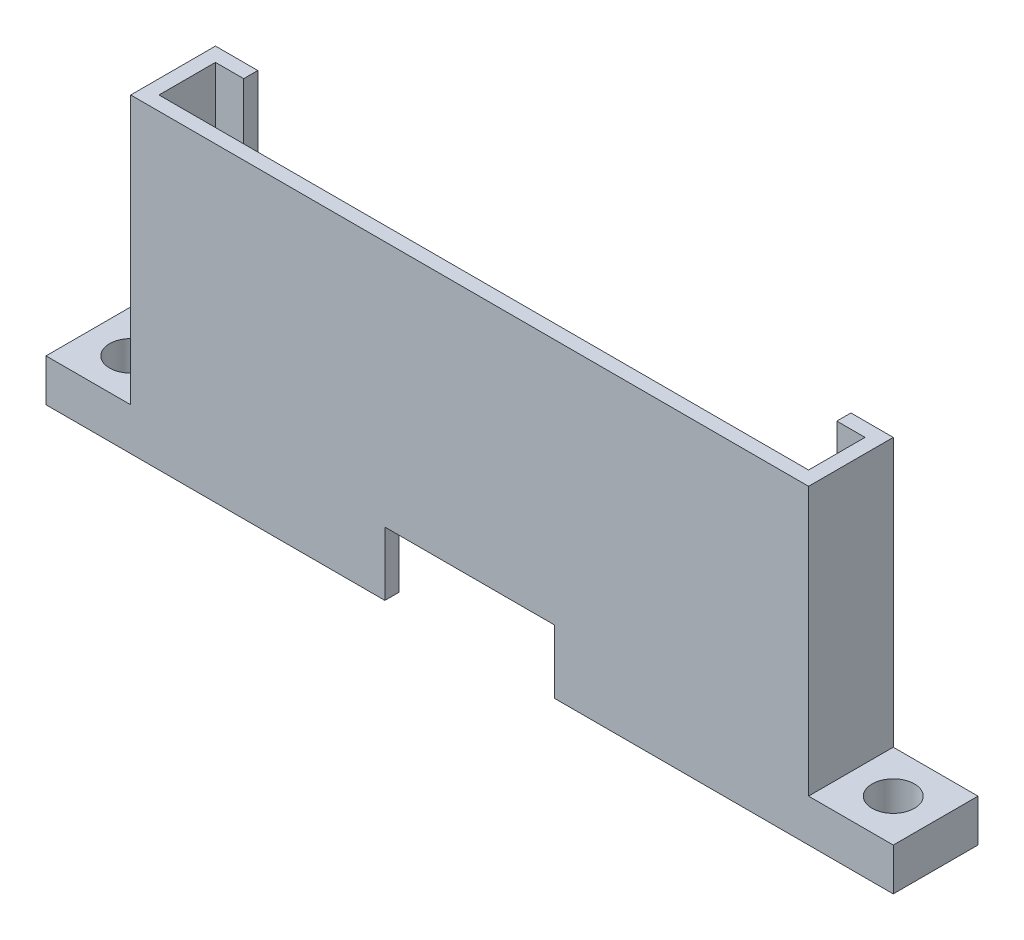
ISO-10303-21;
HEADER;
FILE_DESCRIPTION(('STEP AP214'),'2;1');
FILE_NAME('part.step','',(''),(''),'','','');
FILE_SCHEMA(('AUTOMOTIVE_DESIGN { 1 0 10303 214 1 1 1 1 }'));
ENDSEC;
DATA;
#1=APPLICATION_CONTEXT('core data for automotive mechanical design processes');
#2=APPLICATION_PROTOCOL_DEFINITION('international standard','automotive_design',2000,#1);
#3=PRODUCT_CONTEXT('',#1,'mechanical');
#4=PRODUCT('Part','Part','',(#3));
#5=PRODUCT_RELATED_PRODUCT_CATEGORY('part','',(#4));
#6=PRODUCT_DEFINITION_FORMATION('','',#4);
#7=PRODUCT_DEFINITION_CONTEXT('part definition',#1,'design');
#8=PRODUCT_DEFINITION('design','',#6,#7);
#9=PRODUCT_DEFINITION_SHAPE('','',#8);
#10=(LENGTH_UNIT() NAMED_UNIT(*) SI_UNIT(.MILLI.,.METRE.));
#11=(NAMED_UNIT(*) PLANE_ANGLE_UNIT() SI_UNIT($,.RADIAN.));
#12=(NAMED_UNIT(*) SI_UNIT($,.STERADIAN.) SOLID_ANGLE_UNIT());
#13=UNCERTAINTY_MEASURE_WITH_UNIT(LENGTH_MEASURE(1.E-05),#10,'distance_accuracy_value','');
#14=(GEOMETRIC_REPRESENTATION_CONTEXT(3) GLOBAL_UNCERTAINTY_ASSIGNED_CONTEXT((#13)) GLOBAL_UNIT_ASSIGNED_CONTEXT((#10,
#11,#12)) REPRESENTATION_CONTEXT('',''));
#15=CARTESIAN_POINT('',(0.,0.,0.));
#16=DIRECTION('',(0.,0.,1.));
#17=DIRECTION('',(1.,0.,0.));
#18=AXIS2_PLACEMENT_3D('',#15,#16,#17);
#19=CARTESIAN_POINT('',(0.,-22.,6.));
#20=DIRECTION('',(0.,1.,0.));
#21=DIRECTION('',(-1.,0.,0.));
#22=AXIS2_PLACEMENT_3D('',#19,#20,#21);
#23=PLANE('',#22);
#24=CARTESIAN_POINT('',(3.,-22.,3.));
#25=DIRECTION('',(0.,1.,0.));
#26=DIRECTION('',(-1.,0.,0.));
#27=AXIS2_PLACEMENT_3D('',#24,#25,#26);
#28=CIRCLE('',#27,1.5);
#29=CARTESIAN_POINT('',(1.5,-22.,3.));
#30=VERTEX_POINT('',#29);
#31=EDGE_CURVE('E195',#30,#30,#28,.T.);
#32=ORIENTED_EDGE('',*,*,#31,.T.);
#33=EDGE_LOOP('',(#32));
#34=FACE_BOUND('',#33,.T.);
#35=DIRECTION('',(0.,0.,1.));
#36=VECTOR('',#35,1.);
#37=CARTESIAN_POINT('',(-18.,-22.,0.));
#38=LINE('',#37,#36);
#39=CARTESIAN_POINT('',(-18.,-22.,5.));
#40=VERTEX_POINT('',#39);
#41=CARTESIAN_POINT('',(-18.,-22.,6.));
#42=VERTEX_POINT('',#41);
#43=EDGE_CURVE('E227',#40,#42,#38,.T.);
#44=ORIENTED_EDGE('',*,*,#43,.F.);
#45=DIRECTION('',(1.,0.,0.));
#46=VECTOR('',#45,1.);
#47=CARTESIAN_POINT('',(-47.,-22.,5.));
#48=LINE('',#47,#46);
#49=CARTESIAN_POINT('',(-0.999999999999998,-22.,5.));
#50=VERTEX_POINT('',#49);
#51=EDGE_CURVE('E268',#40,#50,#48,.T.);
#52=ORIENTED_EDGE('',*,*,#51,.T.);
#53=DIRECTION('',(0.,0.,-1.));
#54=VECTOR('',#53,1.);
#55=CARTESIAN_POINT('',(-0.999999999999998,-22.,5.));
#56=LINE('',#55,#54);
#57=CARTESIAN_POINT('',(-0.999999999999995,-22.,1.));
#58=VERTEX_POINT('',#57);
#59=EDGE_CURVE('E257',#50,#58,#56,.T.);
#60=ORIENTED_EDGE('',*,*,#59,.T.);
#61=DIRECTION('',(-1.,0.,0.));
#62=VECTOR('',#61,1.);
#63=CARTESIAN_POINT('',(-47.,-22.,1.));
#64=LINE('',#63,#62);
#65=CARTESIAN_POINT('',(-3.,-22.,1.));
#66=VERTEX_POINT('',#65);
#67=EDGE_CURVE('E262',#58,#66,#64,.T.);
#68=ORIENTED_EDGE('',*,*,#67,.T.);
#69=DIRECTION('',(0.,0.,1.));
#70=VECTOR('',#69,1.);
#71=CARTESIAN_POINT('',(-3.,-22.,0.));
#72=LINE('',#71,#70);
#73=CARTESIAN_POINT('',(-3.,-22.,0.));
#74=VERTEX_POINT('',#73);
#75=EDGE_CURVE('E237',#74,#66,#72,.T.);
#76=ORIENTED_EDGE('',*,*,#75,.F.);
#77=DIRECTION('',(1.,0.,0.));
#78=VECTOR('',#77,1.);
#79=CARTESIAN_POINT('',(0.,-22.,0.));
#80=LINE('',#79,#78);
#81=CARTESIAN_POINT('',(6.,-22.,0.));
#82=VERTEX_POINT('',#81);
#83=EDGE_CURVE('E311',#74,#82,#80,.T.);
#84=ORIENTED_EDGE('',*,*,#83,.T.);
#85=DIRECTION('',(0.,0.,-1.));
#86=VECTOR('',#85,1.);
#87=CARTESIAN_POINT('',(6.,-22.,6.));
#88=LINE('',#87,#86);
#89=CARTESIAN_POINT('',(6.,-22.,6.));
#90=VERTEX_POINT('',#89);
#91=EDGE_CURVE('E209',#90,#82,#88,.T.);
#92=ORIENTED_EDGE('',*,*,#91,.F.);
#93=DIRECTION('',(1.,0.,0.));
#94=VECTOR('',#93,1.);
#95=CARTESIAN_POINT('',(0.,-22.,6.));
#96=LINE('',#95,#94);
#97=EDGE_CURVE('E299',#42,#90,#96,.T.);
#98=ORIENTED_EDGE('',*,*,#97,.F.);
#99=EDGE_LOOP('',(#44,#52,#60,#68,#76,#84,#92,#98));
#100=FACE_BOUND('',#99,.T.);
#101=ADVANCED_FACE('F33',(#34,#100),#23,.F.);
#102=CARTESIAN_POINT('',(0.,0.,0.));
#103=DIRECTION('',(0.,0.,-1.));
#104=DIRECTION('',(-1.,0.,0.));
#105=AXIS2_PLACEMENT_3D('',#102,#103,#104);
#106=PLANE('',#105);
#107=ORIENTED_EDGE('',*,*,#83,.F.);
#108=DIRECTION('',(0.,1.,0.));
#109=VECTOR('',#108,1.);
#110=CARTESIAN_POINT('',(-3.,-22.,0.));
#111=LINE('',#110,#109);
#112=CARTESIAN_POINT('',(-3.,0.,0.));
#113=VERTEX_POINT('',#112);
#114=EDGE_CURVE('E253',#74,#113,#111,.T.);
#115=ORIENTED_EDGE('',*,*,#114,.T.);
#116=DIRECTION('',(-1.,0.,0.));
#117=VECTOR('',#116,1.);
#118=CARTESIAN_POINT('',(0.,0.,0.));
#119=LINE('',#118,#117);
#120=CARTESIAN_POINT('',(0.,0.,0.));
#121=VERTEX_POINT('',#120);
#122=EDGE_CURVE('E305',#121,#113,#119,.T.);
#123=ORIENTED_EDGE('',*,*,#122,.F.);
#124=DIRECTION('',(0.,1.,0.));
#125=VECTOR('',#124,1.);
#126=CARTESIAN_POINT('',(0.,0.,0.));
#127=LINE('',#126,#125);
#128=CARTESIAN_POINT('',(0.,-19.,0.));
#129=VERTEX_POINT('',#128);
#130=EDGE_CURVE('E285',#129,#121,#127,.T.);
#131=ORIENTED_EDGE('',*,*,#130,.F.);
#132=DIRECTION('',(-1.,0.,0.));
#133=VECTOR('',#132,1.);
#134=CARTESIAN_POINT('',(6.,-19.,0.));
#135=LINE('',#134,#133);
#136=CARTESIAN_POINT('',(6.,-19.,0.));
#137=VERTEX_POINT('',#136);
#138=EDGE_CURVE('E56',#137,#129,#135,.T.);
#139=ORIENTED_EDGE('',*,*,#138,.F.);
#140=DIRECTION('',(0.,1.,0.));
#141=VECTOR('',#140,1.);
#142=CARTESIAN_POINT('',(6.,-22.,0.));
#143=LINE('',#142,#141);
#144=EDGE_CURVE('E207',#82,#137,#143,.T.);
#145=ORIENTED_EDGE('',*,*,#144,.F.);
#146=EDGE_LOOP('',(#107,#115,#123,#131,#139,#145));
#147=FACE_BOUND('',#146,.T.);
#148=ADVANCED_FACE('F368',(#147),#106,.T.);
#149=CARTESIAN_POINT('',(-47.,-22.,1.));
#150=DIRECTION('',(0.,0.,-1.));
#151=DIRECTION('',(-1.,0.,0.));
#152=AXIS2_PLACEMENT_3D('',#149,#150,#151);
#153=PLANE('',#152);
#154=DIRECTION('',(0.,1.,0.));
#155=VECTOR('',#154,1.);
#156=CARTESIAN_POINT('',(-3.,-22.,1.));
#157=LINE('',#156,#155);
#158=CARTESIAN_POINT('',(-3.,0.,1.));
#159=VERTEX_POINT('',#158);
#160=EDGE_CURVE('E243',#66,#159,#157,.T.);
#161=ORIENTED_EDGE('',*,*,#160,.F.);
#162=ORIENTED_EDGE('',*,*,#67,.F.);
#163=DIRECTION('',(0.,1.,0.));
#164=VECTOR('',#163,1.);
#165=CARTESIAN_POINT('',(-0.999999999999995,-22.,1.));
#166=LINE('',#165,#164);
#167=CARTESIAN_POINT('',(-0.999999999999995,0.,1.));
#168=VERTEX_POINT('',#167);
#169=EDGE_CURVE('E272',#58,#168,#166,.T.);
#170=ORIENTED_EDGE('',*,*,#169,.T.);
#171=DIRECTION('',(-1.,0.,0.));
#172=VECTOR('',#171,1.);
#173=CARTESIAN_POINT('',(-47.,0.,1.));
#174=LINE('',#173,#172);
#175=EDGE_CURVE('E275',#168,#159,#174,.T.);
#176=ORIENTED_EDGE('',*,*,#175,.T.);
#177=EDGE_LOOP('',(#161,#162,#170,#176));
#178=FACE_BOUND('',#177,.T.);
#179=ADVANCED_FACE('F362',(#178),#153,.F.);
#180=CARTESIAN_POINT('',(0.,0.,6.));
#181=DIRECTION('',(-1.,0.,0.));
#182=DIRECTION('',(0.,-1.,0.));
#183=AXIS2_PLACEMENT_3D('',#180,#181,#182);
#184=PLANE('',#183);
#185=DIRECTION('',(0.,1.,0.));
#186=VECTOR('',#185,1.);
#187=CARTESIAN_POINT('',(0.,0.,6.));
#188=LINE('',#187,#186);
#189=CARTESIAN_POINT('',(0.,-19.,6.));
#190=VERTEX_POINT('',#189);
#191=CARTESIAN_POINT('',(0.,0.,6.));
#192=VERTEX_POINT('',#191);
#193=EDGE_CURVE('E293',#190,#192,#188,.T.);
#194=ORIENTED_EDGE('',*,*,#193,.F.);
#195=DIRECTION('',(0.,0.,-1.));
#196=VECTOR('',#195,1.);
#197=CARTESIAN_POINT('',(0.,-19.,6.));
#198=LINE('',#197,#196);
#199=EDGE_CURVE('E203',#190,#129,#198,.T.);
#200=ORIENTED_EDGE('',*,*,#199,.T.);
#201=ORIENTED_EDGE('',*,*,#130,.T.);
#202=DIRECTION('',(0.,0.,-1.));
#203=VECTOR('',#202,1.);
#204=CARTESIAN_POINT('',(0.,0.,6.));
#205=LINE('',#204,#203);
#206=EDGE_CURVE('E316',#192,#121,#205,.T.);
#207=ORIENTED_EDGE('',*,*,#206,.F.);
#208=EDGE_LOOP('',(#194,#200,#201,#207));
#209=FACE_BOUND('',#208,.T.);
#210=ADVANCED_FACE('F35',(#209),#184,.F.);
#211=CARTESIAN_POINT('',(0.,0.,6.));
#212=DIRECTION('',(0.,-1.,0.));
#213=DIRECTION('',(1.,0.,0.));
#214=AXIS2_PLACEMENT_3D('',#211,#212,#213);
#215=PLANE('',#214);
#216=CARTESIAN_POINT('',(-45.,0.,1.));
#217=VERTEX_POINT('',#216);
#218=CARTESIAN_POINT('',(-47.,0.,1.));
#219=VERTEX_POINT('',#218);
#220=EDGE_CURVE('E274',#217,#219,#174,.T.);
#221=ORIENTED_EDGE('',*,*,#220,.F.);
#222=DIRECTION('',(0.,0.,1.));
#223=VECTOR('',#222,1.);
#224=CARTESIAN_POINT('',(-45.,0.,0.));
#225=LINE('',#224,#223);
#226=CARTESIAN_POINT('',(-45.,0.,0.));
#227=VERTEX_POINT('',#226);
#228=EDGE_CURVE('E240',#227,#217,#225,.T.);
#229=ORIENTED_EDGE('',*,*,#228,.F.);
#230=CARTESIAN_POINT('',(-48.,0.,0.));
#231=VERTEX_POINT('',#230);
#232=EDGE_CURVE('E304',#227,#231,#119,.T.);
#233=ORIENTED_EDGE('',*,*,#232,.T.);
#234=DIRECTION('',(0.,0.,-1.));
#235=VECTOR('',#234,1.);
#236=CARTESIAN_POINT('',(-48.,0.,6.));
#237=LINE('',#236,#235);
#238=CARTESIAN_POINT('',(-48.,0.,6.));
#239=VERTEX_POINT('',#238);
#240=EDGE_CURVE('E302',#239,#231,#237,.T.);
#241=ORIENTED_EDGE('',*,*,#240,.F.);
#242=DIRECTION('',(-1.,0.,0.));
#243=VECTOR('',#242,1.);
#244=CARTESIAN_POINT('',(0.,0.,6.));
#245=LINE('',#244,#243);
#246=EDGE_CURVE('E295',#192,#239,#245,.T.);
#247=ORIENTED_EDGE('',*,*,#246,.F.);
#248=ORIENTED_EDGE('',*,*,#206,.T.);
#249=ORIENTED_EDGE('',*,*,#122,.T.);
#250=DIRECTION('',(0.,0.,1.));
#251=VECTOR('',#250,1.);
#252=CARTESIAN_POINT('',(-3.,0.,0.));
#253=LINE('',#252,#251);
#254=EDGE_CURVE('E231',#113,#159,#253,.T.);
#255=ORIENTED_EDGE('',*,*,#254,.T.);
#256=ORIENTED_EDGE('',*,*,#175,.F.);
#257=DIRECTION('',(0.,0.,-1.));
#258=VECTOR('',#257,1.);
#259=CARTESIAN_POINT('',(-1.,0.,5.));
#260=LINE('',#259,#258);
#261=CARTESIAN_POINT('',(-1.,0.,5.));
#262=VERTEX_POINT('',#261);
#263=EDGE_CURVE('E250',#262,#168,#260,.T.);
#264=ORIENTED_EDGE('',*,*,#263,.F.);
#265=DIRECTION('',(1.,0.,0.));
#266=VECTOR('',#265,1.);
#267=CARTESIAN_POINT('',(-47.,0.,5.));
#268=LINE('',#267,#266);
#269=CARTESIAN_POINT('',(-47.,0.,5.));
#270=VERTEX_POINT('',#269);
#271=EDGE_CURVE('E261',#270,#262,#268,.T.);
#272=ORIENTED_EDGE('',*,*,#271,.F.);
#273=DIRECTION('',(0.,0.,1.));
#274=VECTOR('',#273,1.);
#275=CARTESIAN_POINT('',(-47.,0.,5.));
#276=LINE('',#275,#274);
#277=EDGE_CURVE('E278',#219,#270,#276,.T.);
#278=ORIENTED_EDGE('',*,*,#277,.F.);
#279=EDGE_LOOP('',(#221,#229,#233,#241,#247,#248,#249,#255,#256,#264,#272,#278));
#280=FACE_BOUND('',#279,.T.);
#281=ADVANCED_FACE('F354',(#280),#215,.F.);
#282=CARTESIAN_POINT('',(-48.,0.,6.));
#283=DIRECTION('',(1.,0.,0.));
#284=DIRECTION('',(0.,0.,-1.));
#285=AXIS2_PLACEMENT_3D('',#282,#283,#284);
#286=PLANE('',#285);
#287=DIRECTION('',(0.,-1.,0.));
#288=VECTOR('',#287,1.);
#289=CARTESIAN_POINT('',(-48.,0.,0.));
#290=LINE('',#289,#288);
#291=CARTESIAN_POINT('',(-48.,-19.,0.));
#292=VERTEX_POINT('',#291);
#293=EDGE_CURVE('E308',#231,#292,#290,.T.);
#294=ORIENTED_EDGE('',*,*,#293,.T.);
#295=DIRECTION('',(0.,0.,1.));
#296=VECTOR('',#295,1.);
#297=CARTESIAN_POINT('',(-48.,-19.,0.));
#298=LINE('',#297,#296);
#299=CARTESIAN_POINT('',(-48.,-19.,6.));
#300=VERTEX_POINT('',#299);
#301=EDGE_CURVE('E193',#292,#300,#298,.T.);
#302=ORIENTED_EDGE('',*,*,#301,.T.);
#303=DIRECTION('',(0.,-1.,0.));
#304=VECTOR('',#303,1.);
#305=CARTESIAN_POINT('',(-48.,0.,6.));
#306=LINE('',#305,#304);
#307=EDGE_CURVE('E188',#239,#300,#306,.T.);
#308=ORIENTED_EDGE('',*,*,#307,.F.);
#309=ORIENTED_EDGE('',*,*,#240,.T.);
#310=EDGE_LOOP('',(#294,#302,#308,#309));
#311=FACE_BOUND('',#310,.T.);
#312=ADVANCED_FACE('F405',(#311),#286,.F.);
#313=CARTESIAN_POINT('',(-51.,-22.,3.));
#314=DIRECTION('',(0.,1.,0.));
#315=DIRECTION('',(0.,0.,1.));
#316=AXIS2_PLACEMENT_3D('',#313,#314,#315);
#317=CIRCLE('',#316,1.5);
#318=CARTESIAN_POINT('',(-51.,-22.,4.5));
#319=VERTEX_POINT('',#318);
#320=EDGE_CURVE('E415',#319,#319,#317,.T.);
#321=ORIENTED_EDGE('',*,*,#320,.T.);
#322=EDGE_LOOP('',(#321));
#323=FACE_BOUND('',#322,.T.);
#324=CARTESIAN_POINT('',(-47.,-22.,5.));
#325=VERTEX_POINT('',#324);
#326=CARTESIAN_POINT('',(-30.,-22.,5.));
#327=VERTEX_POINT('',#326);
#328=EDGE_CURVE('E269',#325,#327,#48,.T.);
#329=ORIENTED_EDGE('',*,*,#328,.T.);
#330=DIRECTION('',(0.,0.,1.));
#331=VECTOR('',#330,1.);
#332=CARTESIAN_POINT('',(-30.,-22.,0.));
#333=LINE('',#332,#331);
#334=CARTESIAN_POINT('',(-30.,-22.,6.));
#335=VERTEX_POINT('',#334);
#336=EDGE_CURVE('E228',#327,#335,#333,.T.);
#337=ORIENTED_EDGE('',*,*,#336,.T.);
#338=CARTESIAN_POINT('',(-54.,-22.,6.));
#339=VERTEX_POINT('',#338);
#340=EDGE_CURVE('E300',#339,#335,#96,.T.);
#341=ORIENTED_EDGE('',*,*,#340,.F.);
#342=DIRECTION('',(0.,0.,1.));
#343=VECTOR('',#342,1.);
#344=CARTESIAN_POINT('',(-54.,-22.,0.));
#345=LINE('',#344,#343);
#346=CARTESIAN_POINT('',(-54.,-22.,0.));
#347=VERTEX_POINT('',#346);
#348=EDGE_CURVE('E181',#347,#339,#345,.T.);
#349=ORIENTED_EDGE('',*,*,#348,.F.);
#350=CARTESIAN_POINT('',(-45.,-22.,0.));
#351=VERTEX_POINT('',#350);
#352=EDGE_CURVE('E296',#347,#351,#80,.T.);
#353=ORIENTED_EDGE('',*,*,#352,.T.);
#354=DIRECTION('',(0.,0.,1.));
#355=VECTOR('',#354,1.);
#356=CARTESIAN_POINT('',(-45.,-22.,0.));
#357=LINE('',#356,#355);
#358=CARTESIAN_POINT('',(-45.,-22.,1.));
#359=VERTEX_POINT('',#358);
#360=EDGE_CURVE('E239',#351,#359,#357,.T.);
#361=ORIENTED_EDGE('',*,*,#360,.T.);
#362=CARTESIAN_POINT('',(-47.,-22.,1.));
#363=VERTEX_POINT('',#362);
#364=EDGE_CURVE('E260',#359,#363,#64,.T.);
#365=ORIENTED_EDGE('',*,*,#364,.T.);
#366=DIRECTION('',(0.,0.,1.));
#367=VECTOR('',#366,1.);
#368=CARTESIAN_POINT('',(-47.,-22.,5.));
#369=LINE('',#368,#367);
#370=EDGE_CURVE('E265',#363,#325,#369,.T.);
#371=ORIENTED_EDGE('',*,*,#370,.T.);
#372=EDGE_LOOP('',(#329,#337,#341,#349,#353,#361,#365,#371));
#373=FACE_BOUND('',#372,.T.);
#374=ADVANCED_FACE('F343',(#323,#373),#23,.F.);
#375=CARTESIAN_POINT('',(0.,0.,6.));
#376=DIRECTION('',(0.,0.,-1.));
#377=DIRECTION('',(-1.,0.,0.));
#378=AXIS2_PLACEMENT_3D('',#375,#376,#377);
#379=PLANE('',#378);
#380=ORIENTED_EDGE('',*,*,#340,.T.);
#381=DIRECTION('',(0.,-1.,0.));
#382=VECTOR('',#381,1.);
#383=CARTESIAN_POINT('',(-30.,-17.5,6.));
#384=LINE('',#383,#382);
#385=CARTESIAN_POINT('',(-30.,-17.5,6.));
#386=VERTEX_POINT('',#385);
#387=EDGE_CURVE('E225',#386,#335,#384,.T.);
#388=ORIENTED_EDGE('',*,*,#387,.F.);
#389=DIRECTION('',(1.,0.,0.));
#390=VECTOR('',#389,1.);
#391=CARTESIAN_POINT('',(-30.,-17.5,6.));
#392=LINE('',#391,#390);
#393=CARTESIAN_POINT('',(-18.,-17.5,6.));
#394=VERTEX_POINT('',#393);
#395=EDGE_CURVE('E222',#386,#394,#392,.T.);
#396=ORIENTED_EDGE('',*,*,#395,.T.);
#397=DIRECTION('',(0.,-1.,0.));
#398=VECTOR('',#397,1.);
#399=CARTESIAN_POINT('',(-18.,-17.5,6.));
#400=LINE('',#399,#398);
#401=EDGE_CURVE('E218',#394,#42,#400,.T.);
#402=ORIENTED_EDGE('',*,*,#401,.T.);
#403=ORIENTED_EDGE('',*,*,#97,.T.);
#404=DIRECTION('',(0.,1.,0.));
#405=VECTOR('',#404,1.);
#406=CARTESIAN_POINT('',(6.,-22.,6.));
#407=LINE('',#406,#405);
#408=CARTESIAN_POINT('',(6.,-19.,6.));
#409=VERTEX_POINT('',#408);
#410=EDGE_CURVE('E212',#90,#409,#407,.T.);
#411=ORIENTED_EDGE('',*,*,#410,.T.);
#412=DIRECTION('',(-1.,0.,0.));
#413=VECTOR('',#412,1.);
#414=CARTESIAN_POINT('',(6.,-19.,6.));
#415=LINE('',#414,#413);
#416=EDGE_CURVE('E216',#409,#190,#415,.T.);
#417=ORIENTED_EDGE('',*,*,#416,.T.);
#418=ORIENTED_EDGE('',*,*,#193,.T.);
#419=ORIENTED_EDGE('',*,*,#246,.T.);
#420=ORIENTED_EDGE('',*,*,#307,.T.);
#421=DIRECTION('',(1.,0.,0.));
#422=VECTOR('',#421,1.);
#423=CARTESIAN_POINT('',(-54.,-19.,6.));
#424=LINE('',#423,#422);
#425=CARTESIAN_POINT('',(-54.,-19.,6.));
#426=VERTEX_POINT('',#425);
#427=EDGE_CURVE('E48',#426,#300,#424,.T.);
#428=ORIENTED_EDGE('',*,*,#427,.F.);
#429=DIRECTION('',(0.,1.,0.));
#430=VECTOR('',#429,1.);
#431=CARTESIAN_POINT('',(-54.,-22.,6.));
#432=LINE('',#431,#430);
#433=EDGE_CURVE('E175',#339,#426,#432,.T.);
#434=ORIENTED_EDGE('',*,*,#433,.F.);
#435=EDGE_LOOP('',(#380,#388,#396,#402,#403,#411,#417,#418,#419,#420,#428,#434));
#436=FACE_BOUND('',#435,.T.);
#437=ADVANCED_FACE('F186',(#436),#379,.F.);
#438=DIRECTION('',(0.,1.,0.));
#439=VECTOR('',#438,1.);
#440=CARTESIAN_POINT('',(-45.,-22.,0.));
#441=LINE('',#440,#439);
#442=EDGE_CURVE('E251',#351,#227,#441,.T.);
#443=ORIENTED_EDGE('',*,*,#442,.F.);
#444=ORIENTED_EDGE('',*,*,#352,.F.);
#445=DIRECTION('',(0.,1.,0.));
#446=VECTOR('',#445,1.);
#447=CARTESIAN_POINT('',(-54.,-22.,0.));
#448=LINE('',#447,#446);
#449=CARTESIAN_POINT('',(-54.,-19.,0.));
#450=VERTEX_POINT('',#449);
#451=EDGE_CURVE('E190',#347,#450,#448,.T.);
#452=ORIENTED_EDGE('',*,*,#451,.T.);
#453=DIRECTION('',(1.,0.,0.));
#454=VECTOR('',#453,1.);
#455=CARTESIAN_POINT('',(-54.,-19.,0.));
#456=LINE('',#455,#454);
#457=EDGE_CURVE('E189',#450,#292,#456,.T.);
#458=ORIENTED_EDGE('',*,*,#457,.T.);
#459=ORIENTED_EDGE('',*,*,#293,.F.);
#460=ORIENTED_EDGE('',*,*,#232,.F.);
#461=EDGE_LOOP('',(#443,#444,#452,#458,#459,#460));
#462=FACE_BOUND('',#461,.T.);
#463=ADVANCED_FACE('F401',(#462),#106,.T.);
#464=CARTESIAN_POINT('',(-0.999999999999998,-22.,5.));
#465=DIRECTION('',(1.,0.,0.));
#466=DIRECTION('',(0.,0.,-1.));
#467=AXIS2_PLACEMENT_3D('',#464,#465,#466);
#468=PLANE('',#467);
#469=ORIENTED_EDGE('',*,*,#263,.T.);
#470=ORIENTED_EDGE('',*,*,#169,.F.);
#471=ORIENTED_EDGE('',*,*,#59,.F.);
#472=DIRECTION('',(0.,1.,0.));
#473=VECTOR('',#472,1.);
#474=CARTESIAN_POINT('',(-0.999999999999998,-22.,5.));
#475=LINE('',#474,#473);
#476=EDGE_CURVE('E283',#50,#262,#475,.T.);
#477=ORIENTED_EDGE('',*,*,#476,.T.);
#478=EDGE_LOOP('',(#469,#470,#471,#477));
#479=FACE_BOUND('',#478,.T.);
#480=ADVANCED_FACE('F357',(#479),#468,.F.);
#481=CARTESIAN_POINT('',(-47.,-22.,5.));
#482=DIRECTION('',(0.,0.,1.));
#483=DIRECTION('',(1.,0.,0.));
#484=AXIS2_PLACEMENT_3D('',#481,#482,#483);
#485=PLANE('',#484);
#486=DIRECTION('',(1.,0.,0.));
#487=VECTOR('',#486,1.);
#488=CARTESIAN_POINT('',(-47.,-17.5,5.));
#489=LINE('',#488,#487);
#490=CARTESIAN_POINT('',(-30.,-17.5,5.));
#491=VERTEX_POINT('',#490);
#492=CARTESIAN_POINT('',(-18.,-17.5,5.));
#493=VERTEX_POINT('',#492);
#494=EDGE_CURVE('E41',#491,#493,#489,.T.);
#495=ORIENTED_EDGE('',*,*,#494,.F.);
#496=DIRECTION('',(0.,-1.,0.));
#497=VECTOR('',#496,1.);
#498=CARTESIAN_POINT('',(-30.,-22.,5.));
#499=LINE('',#498,#497);
#500=EDGE_CURVE('E11',#491,#327,#499,.T.);
#501=ORIENTED_EDGE('',*,*,#500,.T.);
#502=ORIENTED_EDGE('',*,*,#328,.F.);
#503=DIRECTION('',(0.,1.,0.));
#504=VECTOR('',#503,1.);
#505=CARTESIAN_POINT('',(-47.,-22.,5.));
#506=LINE('',#505,#504);
#507=EDGE_CURVE('E286',#325,#270,#506,.T.);
#508=ORIENTED_EDGE('',*,*,#507,.T.);
#509=ORIENTED_EDGE('',*,*,#271,.T.);
#510=ORIENTED_EDGE('',*,*,#476,.F.);
#511=ORIENTED_EDGE('',*,*,#51,.F.);
#512=DIRECTION('',(0.,-1.,0.));
#513=VECTOR('',#512,1.);
#514=CARTESIAN_POINT('',(-18.,-22.,5.));
#515=LINE('',#514,#513);
#516=EDGE_CURVE('E319',#493,#40,#515,.T.);
#517=ORIENTED_EDGE('',*,*,#516,.F.);
#518=EDGE_LOOP('',(#495,#501,#502,#508,#509,#510,#511,#517));
#519=FACE_BOUND('',#518,.T.);
#520=ADVANCED_FACE('F330',(#519),#485,.F.);
#521=CARTESIAN_POINT('',(-47.,-22.,5.));
#522=DIRECTION('',(-1.,0.,0.));
#523=DIRECTION('',(0.,-1.,0.));
#524=AXIS2_PLACEMENT_3D('',#521,#522,#523);
#525=PLANE('',#524);
#526=ORIENTED_EDGE('',*,*,#277,.T.);
#527=ORIENTED_EDGE('',*,*,#507,.F.);
#528=ORIENTED_EDGE('',*,*,#370,.F.);
#529=DIRECTION('',(0.,1.,0.));
#530=VECTOR('',#529,1.);
#531=CARTESIAN_POINT('',(-47.,-22.,1.));
#532=LINE('',#531,#530);
#533=EDGE_CURVE('E288',#363,#219,#532,.T.);
#534=ORIENTED_EDGE('',*,*,#533,.T.);
#535=EDGE_LOOP('',(#526,#527,#528,#534));
#536=FACE_BOUND('',#535,.T.);
#537=ADVANCED_FACE('F350',(#536),#525,.F.);
#538=ORIENTED_EDGE('',*,*,#364,.F.);
#539=DIRECTION('',(0.,1.,0.));
#540=VECTOR('',#539,1.);
#541=CARTESIAN_POINT('',(-45.,-22.,1.));
#542=LINE('',#541,#540);
#543=EDGE_CURVE('E247',#359,#217,#542,.T.);
#544=ORIENTED_EDGE('',*,*,#543,.T.);
#545=ORIENTED_EDGE('',*,*,#220,.T.);
#546=ORIENTED_EDGE('',*,*,#533,.F.);
#547=EDGE_LOOP('',(#538,#544,#545,#546));
#548=FACE_BOUND('',#547,.T.);
#549=ADVANCED_FACE('F383',(#548),#153,.F.);
#550=CARTESIAN_POINT('',(-3.,-22.,0.));
#551=DIRECTION('',(-1.,0.,0.));
#552=DIRECTION('',(0.,-1.,0.));
#553=AXIS2_PLACEMENT_3D('',#550,#551,#552);
#554=PLANE('',#553);
#555=ORIENTED_EDGE('',*,*,#254,.F.);
#556=ORIENTED_EDGE('',*,*,#114,.F.);
#557=ORIENTED_EDGE('',*,*,#75,.T.);
#558=ORIENTED_EDGE('',*,*,#160,.T.);
#559=EDGE_LOOP('',(#555,#556,#557,#558));
#560=FACE_BOUND('',#559,.T.);
#561=ADVANCED_FACE('F380',(#560),#554,.T.);
#562=CARTESIAN_POINT('',(-45.,-22.,0.));
#563=DIRECTION('',(-1.,0.,0.));
#564=DIRECTION('',(0.,-1.,0.));
#565=AXIS2_PLACEMENT_3D('',#562,#563,#564);
#566=PLANE('',#565);
#567=ORIENTED_EDGE('',*,*,#228,.T.);
#568=ORIENTED_EDGE('',*,*,#543,.F.);
#569=ORIENTED_EDGE('',*,*,#360,.F.);
#570=ORIENTED_EDGE('',*,*,#442,.T.);
#571=EDGE_LOOP('',(#567,#568,#569,#570));
#572=FACE_BOUND('',#571,.T.);
#573=ADVANCED_FACE('F382',(#572),#566,.F.);
#574=CARTESIAN_POINT('',(-30.,-17.5,0.));
#575=DIRECTION('',(-1.,0.,0.));
#576=DIRECTION('',(0.,0.,1.));
#577=AXIS2_PLACEMENT_3D('',#574,#575,#576);
#578=PLANE('',#577);
#579=DIRECTION('',(0.,0.,1.));
#580=VECTOR('',#579,1.);
#581=CARTESIAN_POINT('',(-30.,-17.5,0.));
#582=LINE('',#581,#580);
#583=EDGE_CURVE('E232',#491,#386,#582,.T.);
#584=ORIENTED_EDGE('',*,*,#583,.T.);
#585=ORIENTED_EDGE('',*,*,#387,.T.);
#586=ORIENTED_EDGE('',*,*,#336,.F.);
#587=ORIENTED_EDGE('',*,*,#500,.F.);
#588=EDGE_LOOP('',(#584,#585,#586,#587));
#589=FACE_BOUND('',#588,.T.);
#590=ADVANCED_FACE('F341',(#589),#578,.F.);
#591=CARTESIAN_POINT('',(-30.,-17.5,0.));
#592=DIRECTION('',(0.,-1.,0.));
#593=DIRECTION('',(0.,0.,-1.));
#594=AXIS2_PLACEMENT_3D('',#591,#592,#593);
#595=PLANE('',#594);
#596=ORIENTED_EDGE('',*,*,#494,.T.);
#597=DIRECTION('',(0.,0.,1.));
#598=VECTOR('',#597,1.);
#599=CARTESIAN_POINT('',(-18.,-17.5,0.));
#600=LINE('',#599,#598);
#601=EDGE_CURVE('E234',#493,#394,#600,.T.);
#602=ORIENTED_EDGE('',*,*,#601,.T.);
#603=ORIENTED_EDGE('',*,*,#395,.F.);
#604=ORIENTED_EDGE('',*,*,#583,.F.);
#605=EDGE_LOOP('',(#596,#602,#603,#604));
#606=FACE_BOUND('',#605,.T.);
#607=ADVANCED_FACE('F325',(#606),#595,.T.);
#608=CARTESIAN_POINT('',(-18.,-17.5,0.));
#609=DIRECTION('',(-1.,0.,0.));
#610=DIRECTION('',(0.,-1.,0.));
#611=AXIS2_PLACEMENT_3D('',#608,#609,#610);
#612=PLANE('',#611);
#613=ORIENTED_EDGE('',*,*,#516,.T.);
#614=ORIENTED_EDGE('',*,*,#43,.T.);
#615=ORIENTED_EDGE('',*,*,#401,.F.);
#616=ORIENTED_EDGE('',*,*,#601,.F.);
#617=EDGE_LOOP('',(#613,#614,#615,#616));
#618=FACE_BOUND('',#617,.T.);
#619=ADVANCED_FACE('F334',(#618),#612,.T.);
#620=CARTESIAN_POINT('',(6.,-19.,6.));
#621=DIRECTION('',(0.,1.,0.));
#622=DIRECTION('',(-1.,0.,0.));
#623=AXIS2_PLACEMENT_3D('',#620,#621,#622);
#624=PLANE('',#623);
#625=CARTESIAN_POINT('',(3.,-19.,3.));
#626=DIRECTION('',(0.,1.,0.));
#627=DIRECTION('',(-1.,0.,0.));
#628=AXIS2_PLACEMENT_3D('',#625,#626,#627);
#629=CIRCLE('',#628,1.5);
#630=CARTESIAN_POINT('',(1.5,-19.,3.));
#631=VERTEX_POINT('',#630);
#632=EDGE_CURVE('E198',#631,#631,#629,.T.);
#633=ORIENTED_EDGE('',*,*,#632,.F.);
#634=EDGE_LOOP('',(#633));
#635=FACE_BOUND('',#634,.T.);
#636=ORIENTED_EDGE('',*,*,#199,.F.);
#637=ORIENTED_EDGE('',*,*,#416,.F.);
#638=DIRECTION('',(0.,0.,-1.));
#639=VECTOR('',#638,1.);
#640=CARTESIAN_POINT('',(6.,-19.,6.));
#641=LINE('',#640,#639);
#642=EDGE_CURVE('E205',#409,#137,#641,.T.);
#643=ORIENTED_EDGE('',*,*,#642,.T.);
#644=ORIENTED_EDGE('',*,*,#138,.T.);
#645=EDGE_LOOP('',(#636,#637,#643,#644));
#646=FACE_BOUND('',#645,.T.);
#647=ADVANCED_FACE('F374',(#635,#646),#624,.T.);
#648=CARTESIAN_POINT('',(6.,0.,0.));
#649=DIRECTION('',(1.,0.,0.));
#650=DIRECTION('',(0.,1.,0.));
#651=AXIS2_PLACEMENT_3D('',#648,#649,#650);
#652=PLANE('',#651);
#653=ORIENTED_EDGE('',*,*,#642,.F.);
#654=ORIENTED_EDGE('',*,*,#410,.F.);
#655=ORIENTED_EDGE('',*,*,#91,.T.);
#656=ORIENTED_EDGE('',*,*,#144,.T.);
#657=EDGE_LOOP('',(#653,#654,#655,#656));
#658=FACE_BOUND('',#657,.T.);
#659=ADVANCED_FACE('F373',(#658),#652,.T.);
#660=CARTESIAN_POINT('',(-54.,-19.,0.));
#661=DIRECTION('',(0.,1.,0.));
#662=DIRECTION('',(0.,0.,1.));
#663=AXIS2_PLACEMENT_3D('',#660,#661,#662);
#664=PLANE('',#663);
#665=CARTESIAN_POINT('',(-51.,-19.,3.));
#666=DIRECTION('',(0.,1.,0.));
#667=DIRECTION('',(0.,0.,1.));
#668=AXIS2_PLACEMENT_3D('',#665,#666,#667);
#669=CIRCLE('',#668,1.5);
#670=CARTESIAN_POINT('',(-51.,-19.,4.5));
#671=VERTEX_POINT('',#670);
#672=EDGE_CURVE('E417',#671,#671,#669,.T.);
#673=ORIENTED_EDGE('',*,*,#672,.F.);
#674=EDGE_LOOP('',(#673));
#675=FACE_BOUND('',#674,.T.);
#676=ORIENTED_EDGE('',*,*,#301,.F.);
#677=ORIENTED_EDGE('',*,*,#457,.F.);
#678=DIRECTION('',(0.,0.,1.));
#679=VECTOR('',#678,1.);
#680=CARTESIAN_POINT('',(-54.,-19.,0.));
#681=LINE('',#680,#679);
#682=EDGE_CURVE('E178',#450,#426,#681,.T.);
#683=ORIENTED_EDGE('',*,*,#682,.T.);
#684=ORIENTED_EDGE('',*,*,#427,.T.);
#685=EDGE_LOOP('',(#676,#677,#683,#684));
#686=FACE_BOUND('',#685,.T.);
#687=ADVANCED_FACE('F192',(#675,#686),#664,.T.);
#688=CARTESIAN_POINT('',(-54.,0.,0.));
#689=DIRECTION('',(-1.,0.,0.));
#690=DIRECTION('',(0.,0.,1.));
#691=AXIS2_PLACEMENT_3D('',#688,#689,#690);
#692=PLANE('',#691);
#693=ORIENTED_EDGE('',*,*,#682,.F.);
#694=ORIENTED_EDGE('',*,*,#451,.F.);
#695=ORIENTED_EDGE('',*,*,#348,.T.);
#696=ORIENTED_EDGE('',*,*,#433,.T.);
#697=EDGE_LOOP('',(#693,#694,#695,#696));
#698=FACE_BOUND('',#697,.T.);
#699=ADVANCED_FACE('F176',(#698),#692,.T.);
#700=CARTESIAN_POINT('',(3.,-22.,3.));
#701=DIRECTION('',(0.,1.,0.));
#702=DIRECTION('',(-1.,0.,0.));
#703=AXIS2_PLACEMENT_3D('',#700,#701,#702);
#704=CYLINDRICAL_SURFACE('',#703,1.5);
#705=ORIENTED_EDGE('',*,*,#31,.F.);
#706=EDGE_LOOP('',(#705));
#707=FACE_BOUND('',#706,.T.);
#708=ORIENTED_EDGE('',*,*,#632,.T.);
#709=EDGE_LOOP('',(#708));
#710=FACE_BOUND('',#709,.T.);
#711=ADVANCED_FACE('F424',(#707,#710),#704,.F.);
#712=CARTESIAN_POINT('',(-51.,-22.,3.));
#713=DIRECTION('',(0.,1.,0.));
#714=DIRECTION('',(0.,0.,1.));
#715=AXIS2_PLACEMENT_3D('',#712,#713,#714);
#716=CYLINDRICAL_SURFACE('',#715,1.5);
#717=ORIENTED_EDGE('',*,*,#320,.F.);
#718=EDGE_LOOP('',(#717));
#719=FACE_BOUND('',#718,.T.);
#720=ORIENTED_EDGE('',*,*,#672,.T.);
#721=EDGE_LOOP('',(#720));
#722=FACE_BOUND('',#721,.T.);
#723=ADVANCED_FACE('F427',(#719,#722),#716,.F.);
#724=CLOSED_SHELL('',(#101,#148,#179,#210,#281,#312,#374,#437,#463,#480,#520,#537,#549,#561,
#573,#590,#607,#619,#647,#659,#687,#699,#711,#723));
#725=MANIFOLD_SOLID_BREP('B2',#724);
#726=ADVANCED_BREP_SHAPE_REPRESENTATION('',(#18,#725),#14);
#727=SHAPE_DEFINITION_REPRESENTATION(#9,#726);
ENDSEC;
END-ISO-10303-21;
